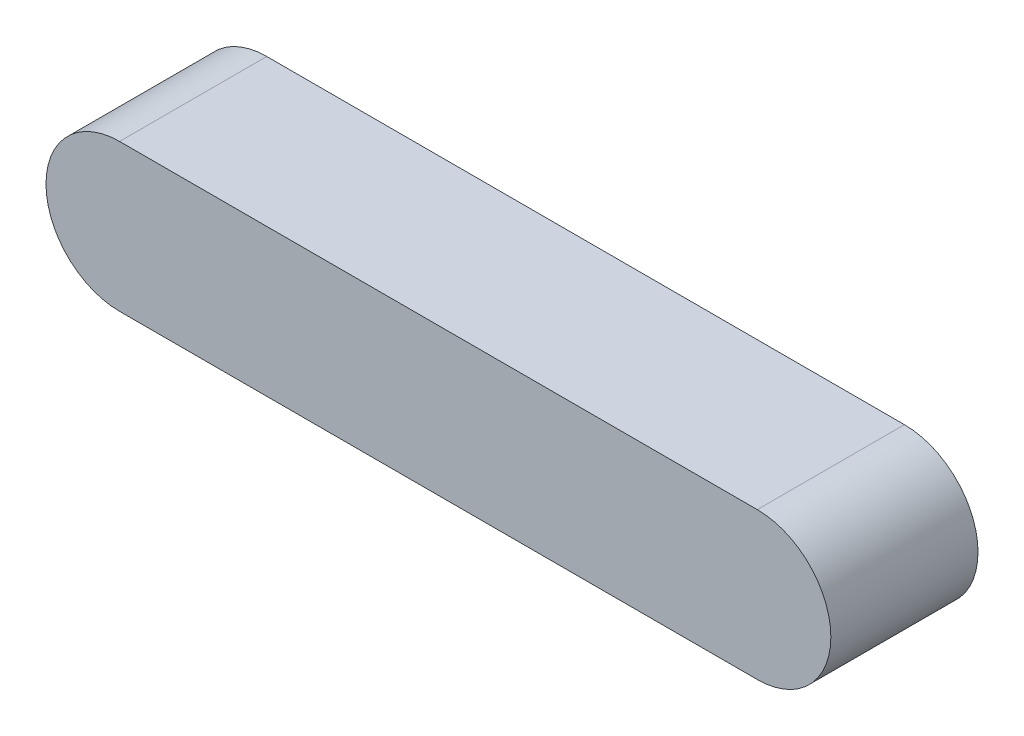
ISO-10303-21;
HEADER;
FILE_DESCRIPTION(('STEP AP214'),'2;1');
FILE_NAME('part.step','',(''),(''),'','','');
FILE_SCHEMA(('AUTOMOTIVE_DESIGN { 1 0 10303 214 1 1 1 1 }'));
ENDSEC;
DATA;
#1=APPLICATION_CONTEXT('core data for automotive mechanical design processes');
#2=APPLICATION_PROTOCOL_DEFINITION('international standard','automotive_design',2000,#1);
#3=PRODUCT_CONTEXT('',#1,'mechanical');
#4=PRODUCT('Part','Part','',(#3));
#5=PRODUCT_RELATED_PRODUCT_CATEGORY('part','',(#4));
#6=PRODUCT_DEFINITION_FORMATION('','',#4);
#7=PRODUCT_DEFINITION_CONTEXT('part definition',#1,'design');
#8=PRODUCT_DEFINITION('design','',#6,#7);
#9=PRODUCT_DEFINITION_SHAPE('','',#8);
#10=(LENGTH_UNIT() NAMED_UNIT(*) SI_UNIT(.MILLI.,.METRE.));
#11=(NAMED_UNIT(*) PLANE_ANGLE_UNIT() SI_UNIT($,.RADIAN.));
#12=(NAMED_UNIT(*) SI_UNIT($,.STERADIAN.) SOLID_ANGLE_UNIT());
#13=UNCERTAINTY_MEASURE_WITH_UNIT(LENGTH_MEASURE(1.E-05),#10,'distance_accuracy_value','');
#14=(GEOMETRIC_REPRESENTATION_CONTEXT(3) GLOBAL_UNCERTAINTY_ASSIGNED_CONTEXT((#13)) GLOBAL_UNIT_ASSIGNED_CONTEXT((#10,
#11,#12)) REPRESENTATION_CONTEXT('',''));
#15=CARTESIAN_POINT('',(0.,0.,0.));
#16=DIRECTION('',(0.,0.,1.));
#17=DIRECTION('',(1.,0.,0.));
#18=AXIS2_PLACEMENT_3D('',#15,#16,#17);
#19=CARTESIAN_POINT('',(0.,0.,3.));
#20=DIRECTION('',(0.,0.,1.));
#21=DIRECTION('',(1.,0.,0.));
#22=AXIS2_PLACEMENT_3D('',#19,#20,#21);
#23=PLANE('',#22);
#24=CARTESIAN_POINT('',(13.,-1.5,3.));
#25=DIRECTION('',(0.,0.,1.));
#26=DIRECTION('',(1.,0.,0.));
#27=AXIS2_PLACEMENT_3D('',#24,#25,#26);
#28=CIRCLE('',#27,1.5);
#29=CARTESIAN_POINT('',(13.,0.,3.));
#30=VERTEX_POINT('',#29);
#31=CARTESIAN_POINT('',(13.,-3.,3.));
#32=VERTEX_POINT('',#31);
#33=EDGE_CURVE('E59',#30,#32,#28,.F.);
#34=ORIENTED_EDGE('',*,*,#33,.F.);
#35=DIRECTION('',(1.,0.,0.));
#36=VECTOR('',#35,1.);
#37=CARTESIAN_POINT('',(13.,0.,3.));
#38=LINE('',#37,#36);
#39=CARTESIAN_POINT('',(0.,0.,3.));
#40=VERTEX_POINT('',#39);
#41=EDGE_CURVE('E56',#40,#30,#38,.T.);
#42=ORIENTED_EDGE('',*,*,#41,.F.);
#43=CARTESIAN_POINT('',(0.,-1.5,3.));
#44=DIRECTION('',(0.,0.,1.));
#45=DIRECTION('',(1.,0.,0.));
#46=AXIS2_PLACEMENT_3D('',#43,#44,#45);
#47=CIRCLE('',#46,1.5);
#48=CARTESIAN_POINT('',(0.,-3.,3.));
#49=VERTEX_POINT('',#48);
#50=EDGE_CURVE('E20',#49,#40,#47,.F.);
#51=ORIENTED_EDGE('',*,*,#50,.F.);
#52=DIRECTION('',(1.,0.,0.));
#53=VECTOR('',#52,1.);
#54=CARTESIAN_POINT('',(0.,-3.,3.));
#55=LINE('',#54,#53);
#56=EDGE_CURVE('E61',#32,#49,#55,.F.);
#57=ORIENTED_EDGE('',*,*,#56,.F.);
#58=EDGE_LOOP('',(#34,#42,#51,#57));
#59=FACE_BOUND('',#58,.T.);
#60=ADVANCED_FACE('F17',(#59),#23,.T.);
#61=CARTESIAN_POINT('',(13.,0.,0.));
#62=DIRECTION('',(0.,1.,0.));
#63=DIRECTION('',(0.,0.,1.));
#64=AXIS2_PLACEMENT_3D('',#61,#62,#63);
#65=PLANE('',#64);
#66=DIRECTION('',(0.,0.,1.));
#67=VECTOR('',#66,1.);
#68=CARTESIAN_POINT('',(0.,0.,0.));
#69=LINE('',#68,#67);
#70=CARTESIAN_POINT('',(0.,0.,0.));
#71=VERTEX_POINT('',#70);
#72=EDGE_CURVE('E71',#40,#71,#69,.F.);
#73=ORIENTED_EDGE('',*,*,#72,.F.);
#74=ORIENTED_EDGE('',*,*,#41,.T.);
#75=DIRECTION('',(0.,0.,1.));
#76=VECTOR('',#75,1.);
#77=CARTESIAN_POINT('',(13.,0.,0.));
#78=LINE('',#77,#76);
#79=CARTESIAN_POINT('',(13.,0.,0.));
#80=VERTEX_POINT('',#79);
#81=EDGE_CURVE('E70',#30,#80,#78,.F.);
#82=ORIENTED_EDGE('',*,*,#81,.T.);
#83=DIRECTION('',(1.,0.,0.));
#84=VECTOR('',#83,1.);
#85=CARTESIAN_POINT('',(0.,0.,0.));
#86=LINE('',#85,#84);
#87=EDGE_CURVE('E82',#80,#71,#86,.F.);
#88=ORIENTED_EDGE('',*,*,#87,.T.);
#89=EDGE_LOOP('',(#73,#74,#82,#88));
#90=FACE_BOUND('',#89,.T.);
#91=ADVANCED_FACE('F68',(#90),#65,.T.);
#92=CARTESIAN_POINT('',(0.,-1.5,0.));
#93=DIRECTION('',(0.,0.,1.));
#94=DIRECTION('',(1.,0.,0.));
#95=AXIS2_PLACEMENT_3D('',#92,#93,#94);
#96=CYLINDRICAL_SURFACE('',#95,1.5);
#97=DIRECTION('',(0.,0.,-1.));
#98=VECTOR('',#97,1.);
#99=CARTESIAN_POINT('',(0.,-3.,0.));
#100=LINE('',#99,#98);
#101=CARTESIAN_POINT('',(0.,-3.,0.));
#102=VERTEX_POINT('',#101);
#103=EDGE_CURVE('E78',#49,#102,#100,.T.);
#104=ORIENTED_EDGE('',*,*,#103,.F.);
#105=ORIENTED_EDGE('',*,*,#50,.T.);
#106=ORIENTED_EDGE('',*,*,#72,.T.);
#107=CARTESIAN_POINT('',(0.,-1.5,0.));
#108=DIRECTION('',(0.,0.,1.));
#109=DIRECTION('',(1.,0.,0.));
#110=AXIS2_PLACEMENT_3D('',#107,#108,#109);
#111=CIRCLE('',#110,1.5);
#112=EDGE_CURVE('E26',#71,#102,#111,.T.);
#113=ORIENTED_EDGE('',*,*,#112,.T.);
#114=EDGE_LOOP('',(#104,#105,#106,#113));
#115=FACE_BOUND('',#114,.T.);
#116=ADVANCED_FACE('F89',(#115),#96,.T.);
#117=CARTESIAN_POINT('',(0.,-3.,0.));
#118=DIRECTION('',(0.,-1.,0.));
#119=DIRECTION('',(0.,0.,-1.));
#120=AXIS2_PLACEMENT_3D('',#117,#118,#119);
#121=PLANE('',#120);
#122=DIRECTION('',(0.,0.,1.));
#123=VECTOR('',#122,1.);
#124=CARTESIAN_POINT('',(13.,-3.,0.));
#125=LINE('',#124,#123);
#126=CARTESIAN_POINT('',(13.,-3.,0.));
#127=VERTEX_POINT('',#126);
#128=EDGE_CURVE('E65',#32,#127,#125,.F.);
#129=ORIENTED_EDGE('',*,*,#128,.F.);
#130=ORIENTED_EDGE('',*,*,#56,.T.);
#131=ORIENTED_EDGE('',*,*,#103,.T.);
#132=DIRECTION('',(1.,0.,0.));
#133=VECTOR('',#132,1.);
#134=CARTESIAN_POINT('',(0.,-3.,0.));
#135=LINE('',#134,#133);
#136=EDGE_CURVE('E11',#102,#127,#135,.T.);
#137=ORIENTED_EDGE('',*,*,#136,.T.);
#138=EDGE_LOOP('',(#129,#130,#131,#137));
#139=FACE_BOUND('',#138,.T.);
#140=ADVANCED_FACE('F91',(#139),#121,.T.);
#141=CARTESIAN_POINT('',(13.,-1.5,0.));
#142=DIRECTION('',(0.,0.,1.));
#143=DIRECTION('',(1.,0.,0.));
#144=AXIS2_PLACEMENT_3D('',#141,#142,#143);
#145=CYLINDRICAL_SURFACE('',#144,1.5);
#146=ORIENTED_EDGE('',*,*,#33,.T.);
#147=ORIENTED_EDGE('',*,*,#128,.T.);
#148=CARTESIAN_POINT('',(13.,-1.5,0.));
#149=DIRECTION('',(0.,0.,1.));
#150=DIRECTION('',(1.,0.,0.));
#151=AXIS2_PLACEMENT_3D('',#148,#149,#150);
#152=CIRCLE('',#151,1.5);
#153=EDGE_CURVE('E35',#127,#80,#152,.T.);
#154=ORIENTED_EDGE('',*,*,#153,.T.);
#155=ORIENTED_EDGE('',*,*,#81,.F.);
#156=EDGE_LOOP('',(#146,#147,#154,#155));
#157=FACE_BOUND('',#156,.T.);
#158=ADVANCED_FACE('F73',(#157),#145,.T.);
#159=CARTESIAN_POINT('',(0.,0.,0.));
#160=DIRECTION('',(0.,0.,1.));
#161=DIRECTION('',(1.,0.,0.));
#162=AXIS2_PLACEMENT_3D('',#159,#160,#161);
#163=PLANE('',#162);
#164=ORIENTED_EDGE('',*,*,#136,.F.);
#165=ORIENTED_EDGE('',*,*,#112,.F.);
#166=ORIENTED_EDGE('',*,*,#87,.F.);
#167=ORIENTED_EDGE('',*,*,#153,.F.);
#168=EDGE_LOOP('',(#164,#165,#166,#167));
#169=FACE_BOUND('',#168,.T.);
#170=ADVANCED_FACE('F90',(#169),#163,.F.);
#171=CLOSED_SHELL('',(#60,#91,#116,#140,#158,#170));
#172=MANIFOLD_SOLID_BREP('B1',#171);
#173=ADVANCED_BREP_SHAPE_REPRESENTATION('',(#18,#172),#14);
#174=SHAPE_DEFINITION_REPRESENTATION(#9,#173);
ENDSEC;
END-ISO-10303-21;
